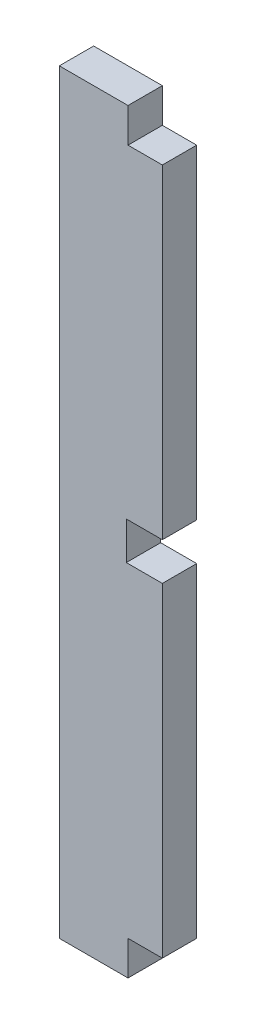
ISO-10303-21;
HEADER;
FILE_DESCRIPTION(('STEP AP214'),'2;1');
FILE_NAME('part.step','',(''),(''),'','','');
FILE_SCHEMA(('AUTOMOTIVE_DESIGN { 1 0 10303 214 1 1 1 1 }'));
ENDSEC;
DATA;
#1=APPLICATION_CONTEXT('core data for automotive mechanical design processes');
#2=APPLICATION_PROTOCOL_DEFINITION('international standard','automotive_design',2000,#1);
#3=PRODUCT_CONTEXT('',#1,'mechanical');
#4=PRODUCT('Part','Part','',(#3));
#5=PRODUCT_RELATED_PRODUCT_CATEGORY('part','',(#4));
#6=PRODUCT_DEFINITION_FORMATION('','',#4);
#7=PRODUCT_DEFINITION_CONTEXT('part definition',#1,'design');
#8=PRODUCT_DEFINITION('design','',#6,#7);
#9=PRODUCT_DEFINITION_SHAPE('','',#8);
#10=(LENGTH_UNIT() NAMED_UNIT(*) SI_UNIT(.MILLI.,.METRE.));
#11=(NAMED_UNIT(*) PLANE_ANGLE_UNIT() SI_UNIT($,.RADIAN.));
#12=(NAMED_UNIT(*) SI_UNIT($,.STERADIAN.) SOLID_ANGLE_UNIT());
#13=UNCERTAINTY_MEASURE_WITH_UNIT(LENGTH_MEASURE(1.E-05),#10,'distance_accuracy_value','');
#14=(GEOMETRIC_REPRESENTATION_CONTEXT(3) GLOBAL_UNCERTAINTY_ASSIGNED_CONTEXT((#13)) GLOBAL_UNIT_ASSIGNED_CONTEXT((#10,
#11,#12)) REPRESENTATION_CONTEXT('',''));
#15=CARTESIAN_POINT('',(0.,0.,0.));
#16=DIRECTION('',(0.,0.,1.));
#17=DIRECTION('',(1.,0.,0.));
#18=AXIS2_PLACEMENT_3D('',#15,#16,#17);
#19=CARTESIAN_POINT('',(-131.454340614119,-208.941167374745,2.5));
#20=DIRECTION('',(-1.,0.,0.));
#21=DIRECTION('',(0.,0.,1.));
#22=AXIS2_PLACEMENT_3D('',#19,#20,#21);
#23=PLANE('',#22);
#24=DIRECTION('',(0.,1.,0.));
#25=VECTOR('',#24,1.);
#26=CARTESIAN_POINT('',(-131.454340614119,-208.941167374745,-2.5));
#27=LINE('',#26,#25);
#28=CARTESIAN_POINT('',(-131.454340614119,-213.941167374745,-2.5));
#29=VERTEX_POINT('',#28);
#30=CARTESIAN_POINT('',(-131.454340614119,-208.941167374745,-2.5));
#31=VERTEX_POINT('',#30);
#32=EDGE_CURVE('E152',#29,#31,#27,.T.);
#33=ORIENTED_EDGE('',*,*,#32,.T.);
#34=DIRECTION('',(0.,0.,-1.));
#35=VECTOR('',#34,1.);
#36=CARTESIAN_POINT('',(-131.454340614119,-208.941167374745,2.5));
#37=LINE('',#36,#35);
#38=CARTESIAN_POINT('',(-131.454340614119,-208.941167374745,2.5));
#39=VERTEX_POINT('',#38);
#40=EDGE_CURVE('E11',#39,#31,#37,.T.);
#41=ORIENTED_EDGE('',*,*,#40,.F.);
#42=DIRECTION('',(0.,1.,0.));
#43=VECTOR('',#42,1.);
#44=CARTESIAN_POINT('',(-131.454340614119,-208.941167374745,2.5));
#45=LINE('',#44,#43);
#46=CARTESIAN_POINT('',(-131.454340614119,-213.941167374745,2.5));
#47=VERTEX_POINT('',#46);
#48=EDGE_CURVE('E174',#47,#39,#45,.T.);
#49=ORIENTED_EDGE('',*,*,#48,.F.);
#50=DIRECTION('',(0.,0.,-1.));
#51=VECTOR('',#50,1.);
#52=CARTESIAN_POINT('',(-131.454340614119,-213.941167374745,2.5));
#53=LINE('',#52,#51);
#54=EDGE_CURVE('E148',#47,#29,#53,.T.);
#55=ORIENTED_EDGE('',*,*,#54,.T.);
#56=EDGE_LOOP('',(#33,#41,#49,#55));
#57=FACE_BOUND('',#56,.T.);
#58=ADVANCED_FACE('F32',(#57),#23,.F.);
#59=CARTESIAN_POINT('',(-126.454340614119,-208.941167374745,2.5));
#60=DIRECTION('',(0.,1.,0.));
#61=DIRECTION('',(0.,0.,1.));
#62=AXIS2_PLACEMENT_3D('',#59,#60,#61);
#63=PLANE('',#62);
#64=DIRECTION('',(1.,0.,0.));
#65=VECTOR('',#64,1.);
#66=CARTESIAN_POINT('',(-126.454340614119,-208.941167374745,-2.5));
#67=LINE('',#66,#65);
#68=CARTESIAN_POINT('',(-126.454340614119,-208.941167374745,-2.5));
#69=VERTEX_POINT('',#68);
#70=EDGE_CURVE('E155',#31,#69,#67,.T.);
#71=ORIENTED_EDGE('',*,*,#70,.T.);
#72=DIRECTION('',(0.,0.,-1.));
#73=VECTOR('',#72,1.);
#74=CARTESIAN_POINT('',(-126.454340614119,-208.941167374745,2.5));
#75=LINE('',#74,#73);
#76=CARTESIAN_POINT('',(-126.454340614119,-208.941167374745,2.5));
#77=VERTEX_POINT('',#76);
#78=EDGE_CURVE('E40',#77,#69,#75,.T.);
#79=ORIENTED_EDGE('',*,*,#78,.F.);
#80=DIRECTION('',(1.,0.,0.));
#81=VECTOR('',#80,1.);
#82=CARTESIAN_POINT('',(-126.454340614119,-208.941167374745,2.5));
#83=LINE('',#82,#81);
#84=EDGE_CURVE('E103',#39,#77,#83,.T.);
#85=ORIENTED_EDGE('',*,*,#84,.F.);
#86=ORIENTED_EDGE('',*,*,#40,.T.);
#87=EDGE_LOOP('',(#71,#79,#85,#86));
#88=FACE_BOUND('',#87,.T.);
#89=ADVANCED_FACE('F252',(#88),#63,.F.);
#90=CARTESIAN_POINT('',(-126.454340614119,-161.691167374746,2.5));
#91=DIRECTION('',(-1.,0.,0.));
#92=DIRECTION('',(0.,0.,1.));
#93=AXIS2_PLACEMENT_3D('',#90,#91,#92);
#94=PLANE('',#93);
#95=DIRECTION('',(0.,1.,0.));
#96=VECTOR('',#95,1.);
#97=CARTESIAN_POINT('',(-126.454340614119,-161.691167374746,-2.5));
#98=LINE('',#97,#96);
#99=CARTESIAN_POINT('',(-126.454340614119,-161.691167374746,-2.5));
#100=VERTEX_POINT('',#99);
#101=EDGE_CURVE('E157',#69,#100,#98,.T.);
#102=ORIENTED_EDGE('',*,*,#101,.T.);
#103=DIRECTION('',(0.,0.,-1.));
#104=VECTOR('',#103,1.);
#105=CARTESIAN_POINT('',(-126.454340614119,-161.691167374746,2.5));
#106=LINE('',#105,#104);
#107=CARTESIAN_POINT('',(-126.454340614119,-161.691167374746,2.5));
#108=VERTEX_POINT('',#107);
#109=EDGE_CURVE('E193',#108,#100,#106,.T.);
#110=ORIENTED_EDGE('',*,*,#109,.F.);
#111=DIRECTION('',(0.,1.,0.));
#112=VECTOR('',#111,1.);
#113=CARTESIAN_POINT('',(-126.454340614119,-161.691167374746,2.5));
#114=LINE('',#113,#112);
#115=EDGE_CURVE('E201',#77,#108,#114,.T.);
#116=ORIENTED_EDGE('',*,*,#115,.F.);
#117=ORIENTED_EDGE('',*,*,#78,.T.);
#118=EDGE_LOOP('',(#102,#110,#116,#117));
#119=FACE_BOUND('',#118,.T.);
#120=ADVANCED_FACE('F199',(#119),#94,.F.);
#121=CARTESIAN_POINT('',(-131.704340614119,-161.691167374746,2.5));
#122=DIRECTION('',(0.,-1.,0.));
#123=DIRECTION('',(0.,0.,-1.));
#124=AXIS2_PLACEMENT_3D('',#121,#122,#123);
#125=PLANE('',#124);
#126=DIRECTION('',(-1.,0.,0.));
#127=VECTOR('',#126,1.);
#128=CARTESIAN_POINT('',(-131.704340614119,-161.691167374746,-2.5));
#129=LINE('',#128,#127);
#130=CARTESIAN_POINT('',(-131.704340614119,-161.691167374746,-2.5));
#131=VERTEX_POINT('',#130);
#132=EDGE_CURVE('E159',#100,#131,#129,.T.);
#133=ORIENTED_EDGE('',*,*,#132,.T.);
#134=DIRECTION('',(0.,0.,-1.));
#135=VECTOR('',#134,1.);
#136=CARTESIAN_POINT('',(-131.704340614119,-161.691167374746,2.5));
#137=LINE('',#136,#135);
#138=CARTESIAN_POINT('',(-131.704340614119,-161.691167374746,2.5));
#139=VERTEX_POINT('',#138);
#140=EDGE_CURVE('E190',#139,#131,#137,.T.);
#141=ORIENTED_EDGE('',*,*,#140,.F.);
#142=DIRECTION('',(-1.,0.,0.));
#143=VECTOR('',#142,1.);
#144=CARTESIAN_POINT('',(-131.704340614119,-161.691167374746,2.5));
#145=LINE('',#144,#143);
#146=EDGE_CURVE('E219',#108,#139,#145,.T.);
#147=ORIENTED_EDGE('',*,*,#146,.F.);
#148=ORIENTED_EDGE('',*,*,#109,.T.);
#149=EDGE_LOOP('',(#133,#141,#147,#148));
#150=FACE_BOUND('',#149,.T.);
#151=ADVANCED_FACE('F210',(#150),#125,.F.);
#152=CARTESIAN_POINT('',(-131.704340614119,-156.191167374746,2.5));
#153=DIRECTION('',(-1.,0.,0.));
#154=DIRECTION('',(0.,0.,1.));
#155=AXIS2_PLACEMENT_3D('',#152,#153,#154);
#156=PLANE('',#155);
#157=DIRECTION('',(0.,1.,0.));
#158=VECTOR('',#157,1.);
#159=CARTESIAN_POINT('',(-131.704340614119,-156.191167374746,-2.5));
#160=LINE('',#159,#158);
#161=CARTESIAN_POINT('',(-131.704340614119,-156.191167374746,-2.5));
#162=VERTEX_POINT('',#161);
#163=EDGE_CURVE('E161',#131,#162,#160,.T.);
#164=ORIENTED_EDGE('',*,*,#163,.T.);
#165=DIRECTION('',(0.,0.,-1.));
#166=VECTOR('',#165,1.);
#167=CARTESIAN_POINT('',(-131.704340614119,-156.191167374746,2.5));
#168=LINE('',#167,#166);
#169=CARTESIAN_POINT('',(-131.704340614119,-156.191167374746,2.5));
#170=VERTEX_POINT('',#169);
#171=EDGE_CURVE('E187',#170,#162,#168,.T.);
#172=ORIENTED_EDGE('',*,*,#171,.F.);
#173=DIRECTION('',(0.,1.,0.));
#174=VECTOR('',#173,1.);
#175=CARTESIAN_POINT('',(-131.704340614119,-156.191167374746,2.5));
#176=LINE('',#175,#174);
#177=EDGE_CURVE('E216',#139,#170,#176,.T.);
#178=ORIENTED_EDGE('',*,*,#177,.F.);
#179=ORIENTED_EDGE('',*,*,#140,.T.);
#180=EDGE_LOOP('',(#164,#172,#178,#179));
#181=FACE_BOUND('',#180,.T.);
#182=ADVANCED_FACE('F214',(#181),#156,.F.);
#183=CARTESIAN_POINT('',(-126.454340614119,-156.191167374746,2.5));
#184=DIRECTION('',(0.,1.,0.));
#185=DIRECTION('',(0.,0.,1.));
#186=AXIS2_PLACEMENT_3D('',#183,#184,#185);
#187=PLANE('',#186);
#188=DIRECTION('',(1.,0.,0.));
#189=VECTOR('',#188,1.);
#190=CARTESIAN_POINT('',(-126.454340614119,-156.191167374746,-2.5));
#191=LINE('',#190,#189);
#192=CARTESIAN_POINT('',(-126.454340614119,-156.191167374746,-2.5));
#193=VERTEX_POINT('',#192);
#194=EDGE_CURVE('E163',#162,#193,#191,.T.);
#195=ORIENTED_EDGE('',*,*,#194,.T.);
#196=DIRECTION('',(0.,0.,-1.));
#197=VECTOR('',#196,1.);
#198=CARTESIAN_POINT('',(-126.454340614119,-156.191167374746,2.5));
#199=LINE('',#198,#197);
#200=CARTESIAN_POINT('',(-126.454340614119,-156.191167374746,2.5));
#201=VERTEX_POINT('',#200);
#202=EDGE_CURVE('E184',#201,#193,#199,.T.);
#203=ORIENTED_EDGE('',*,*,#202,.F.);
#204=DIRECTION('',(1.,0.,0.));
#205=VECTOR('',#204,1.);
#206=CARTESIAN_POINT('',(-126.454340614119,-156.191167374746,2.5));
#207=LINE('',#206,#205);
#208=EDGE_CURVE('E218',#170,#201,#207,.T.);
#209=ORIENTED_EDGE('',*,*,#208,.F.);
#210=ORIENTED_EDGE('',*,*,#171,.T.);
#211=EDGE_LOOP('',(#195,#203,#209,#210));
#212=FACE_BOUND('',#211,.T.);
#213=ADVANCED_FACE('F265',(#212),#187,.F.);
#214=CARTESIAN_POINT('',(-126.454340614119,-108.941167374747,2.5));
#215=DIRECTION('',(-1.,0.,0.));
#216=DIRECTION('',(0.,0.,1.));
#217=AXIS2_PLACEMENT_3D('',#214,#215,#216);
#218=PLANE('',#217);
#219=DIRECTION('',(0.,1.,0.));
#220=VECTOR('',#219,1.);
#221=CARTESIAN_POINT('',(-126.454340614119,-108.941167374747,-2.5));
#222=LINE('',#221,#220);
#223=CARTESIAN_POINT('',(-126.454340614119,-108.941167374747,-2.5));
#224=VERTEX_POINT('',#223);
#225=EDGE_CURVE('E165',#193,#224,#222,.T.);
#226=ORIENTED_EDGE('',*,*,#225,.T.);
#227=DIRECTION('',(0.,0.,-1.));
#228=VECTOR('',#227,1.);
#229=CARTESIAN_POINT('',(-126.454340614119,-108.941167374747,2.5));
#230=LINE('',#229,#228);
#231=CARTESIAN_POINT('',(-126.454340614119,-108.941167374747,2.5));
#232=VERTEX_POINT('',#231);
#233=EDGE_CURVE('E181',#232,#224,#230,.T.);
#234=ORIENTED_EDGE('',*,*,#233,.F.);
#235=DIRECTION('',(0.,1.,0.));
#236=VECTOR('',#235,1.);
#237=CARTESIAN_POINT('',(-126.454340614119,-108.941167374747,2.5));
#238=LINE('',#237,#236);
#239=EDGE_CURVE('E221',#201,#232,#238,.T.);
#240=ORIENTED_EDGE('',*,*,#239,.F.);
#241=ORIENTED_EDGE('',*,*,#202,.T.);
#242=EDGE_LOOP('',(#226,#234,#240,#241));
#243=FACE_BOUND('',#242,.T.);
#244=ADVANCED_FACE('F268',(#243),#218,.F.);
#245=CARTESIAN_POINT('',(-131.454340614119,-108.941167374747,2.5));
#246=DIRECTION('',(0.,-1.,0.));
#247=DIRECTION('',(0.,0.,-1.));
#248=AXIS2_PLACEMENT_3D('',#245,#246,#247);
#249=PLANE('',#248);
#250=DIRECTION('',(-1.,0.,0.));
#251=VECTOR('',#250,1.);
#252=CARTESIAN_POINT('',(-131.454340614119,-108.941167374747,-2.5));
#253=LINE('',#252,#251);
#254=CARTESIAN_POINT('',(-131.454340614119,-108.941167374747,-2.5));
#255=VERTEX_POINT('',#254);
#256=EDGE_CURVE('E167',#224,#255,#253,.T.);
#257=ORIENTED_EDGE('',*,*,#256,.T.);
#258=DIRECTION('',(0.,0.,-1.));
#259=VECTOR('',#258,1.);
#260=CARTESIAN_POINT('',(-131.454340614119,-108.941167374747,2.5));
#261=LINE('',#260,#259);
#262=CARTESIAN_POINT('',(-131.454340614119,-108.941167374747,2.5));
#263=VERTEX_POINT('',#262);
#264=EDGE_CURVE('E178',#263,#255,#261,.T.);
#265=ORIENTED_EDGE('',*,*,#264,.F.);
#266=DIRECTION('',(-1.,0.,0.));
#267=VECTOR('',#266,1.);
#268=CARTESIAN_POINT('',(-131.454340614119,-108.941167374747,2.5));
#269=LINE('',#268,#267);
#270=EDGE_CURVE('E227',#232,#263,#269,.T.);
#271=ORIENTED_EDGE('',*,*,#270,.F.);
#272=ORIENTED_EDGE('',*,*,#233,.T.);
#273=EDGE_LOOP('',(#257,#265,#271,#272));
#274=FACE_BOUND('',#273,.T.);
#275=ADVANCED_FACE('F233',(#274),#249,.F.);
#276=CARTESIAN_POINT('',(-131.454340614117,-103.941167374747,2.5));
#277=DIRECTION('',(-1.,2.88657986402544E-13,0.));
#278=DIRECTION('',(-2.88657986402544E-13,-1.,0.));
#279=AXIS2_PLACEMENT_3D('',#276,#277,#278);
#280=PLANE('',#279);
#281=DIRECTION('',(2.88657986402544E-13,1.,0.));
#282=VECTOR('',#281,1.);
#283=CARTESIAN_POINT('',(-131.454340614117,-103.941167374747,-2.5));
#284=LINE('',#283,#282);
#285=CARTESIAN_POINT('',(-131.454340614117,-103.941167374747,-2.5));
#286=VERTEX_POINT('',#285);
#287=EDGE_CURVE('E169',#255,#286,#284,.T.);
#288=ORIENTED_EDGE('',*,*,#287,.T.);
#289=DIRECTION('',(0.,0.,-1.));
#290=VECTOR('',#289,1.);
#291=CARTESIAN_POINT('',(-131.454340614117,-103.941167374747,2.5));
#292=LINE('',#291,#290);
#293=CARTESIAN_POINT('',(-131.454340614117,-103.941167374747,2.5));
#294=VERTEX_POINT('',#293);
#295=EDGE_CURVE('E143',#294,#286,#292,.T.);
#296=ORIENTED_EDGE('',*,*,#295,.F.);
#297=DIRECTION('',(2.88657986402544E-13,1.,0.));
#298=VECTOR('',#297,1.);
#299=CARTESIAN_POINT('',(-131.454340614117,-103.941167374747,2.5));
#300=LINE('',#299,#298);
#301=EDGE_CURVE('E134',#263,#294,#300,.T.);
#302=ORIENTED_EDGE('',*,*,#301,.F.);
#303=ORIENTED_EDGE('',*,*,#264,.T.);
#304=EDGE_LOOP('',(#288,#296,#302,#303));
#305=FACE_BOUND('',#304,.T.);
#306=ADVANCED_FACE('F237',(#305),#280,.F.);
#307=CARTESIAN_POINT('',(-141.454340614118,-103.941167374747,2.5));
#308=DIRECTION('',(0.,-1.,0.));
#309=DIRECTION('',(0.,0.,-1.));
#310=AXIS2_PLACEMENT_3D('',#307,#308,#309);
#311=PLANE('',#310);
#312=DIRECTION('',(-1.,0.,0.));
#313=VECTOR('',#312,1.);
#314=CARTESIAN_POINT('',(-141.454340614118,-103.941167374747,-2.5));
#315=LINE('',#314,#313);
#316=CARTESIAN_POINT('',(-141.454340614118,-103.941167374747,-2.5));
#317=VERTEX_POINT('',#316);
#318=EDGE_CURVE('E142',#286,#317,#315,.T.);
#319=ORIENTED_EDGE('',*,*,#318,.T.);
#320=DIRECTION('',(0.,0.,-1.));
#321=VECTOR('',#320,1.);
#322=CARTESIAN_POINT('',(-141.454340614118,-103.941167374747,2.5));
#323=LINE('',#322,#321);
#324=CARTESIAN_POINT('',(-141.454340614118,-103.941167374747,2.5));
#325=VERTEX_POINT('',#324);
#326=EDGE_CURVE('E139',#325,#317,#323,.T.);
#327=ORIENTED_EDGE('',*,*,#326,.F.);
#328=DIRECTION('',(-1.,0.,0.));
#329=VECTOR('',#328,1.);
#330=CARTESIAN_POINT('',(-141.454340614118,-103.941167374747,2.5));
#331=LINE('',#330,#329);
#332=EDGE_CURVE('E128',#294,#325,#331,.T.);
#333=ORIENTED_EDGE('',*,*,#332,.F.);
#334=ORIENTED_EDGE('',*,*,#295,.T.);
#335=EDGE_LOOP('',(#319,#327,#333,#334));
#336=FACE_BOUND('',#335,.T.);
#337=ADVANCED_FACE('F140',(#336),#311,.F.);
#338=CARTESIAN_POINT('',(-141.454340614118,-213.941167374745,2.5));
#339=DIRECTION('',(1.,0.,0.));
#340=DIRECTION('',(0.,0.,-1.));
#341=AXIS2_PLACEMENT_3D('',#338,#339,#340);
#342=PLANE('',#341);
#343=DIRECTION('',(0.,-1.,0.));
#344=VECTOR('',#343,1.);
#345=CARTESIAN_POINT('',(-141.454340614118,-213.941167374745,-2.5));
#346=LINE('',#345,#344);
#347=CARTESIAN_POINT('',(-141.454340614118,-213.941167374745,-2.5));
#348=VERTEX_POINT('',#347);
#349=EDGE_CURVE('E89',#317,#348,#346,.T.);
#350=ORIENTED_EDGE('',*,*,#349,.T.);
#351=DIRECTION('',(0.,0.,-1.));
#352=VECTOR('',#351,1.);
#353=CARTESIAN_POINT('',(-141.454340614118,-213.941167374745,2.5));
#354=LINE('',#353,#352);
#355=CARTESIAN_POINT('',(-141.454340614118,-213.941167374745,2.5));
#356=VERTEX_POINT('',#355);
#357=EDGE_CURVE('E144',#356,#348,#354,.T.);
#358=ORIENTED_EDGE('',*,*,#357,.F.);
#359=DIRECTION('',(0.,-1.,0.));
#360=VECTOR('',#359,1.);
#361=CARTESIAN_POINT('',(-141.454340614118,-213.941167374745,2.5));
#362=LINE('',#361,#360);
#363=EDGE_CURVE('E132',#325,#356,#362,.T.);
#364=ORIENTED_EDGE('',*,*,#363,.F.);
#365=ORIENTED_EDGE('',*,*,#326,.T.);
#366=EDGE_LOOP('',(#350,#358,#364,#365));
#367=FACE_BOUND('',#366,.T.);
#368=ADVANCED_FACE('F146',(#367),#342,.F.);
#369=CARTESIAN_POINT('',(-131.454340614119,-213.941167374745,2.5));
#370=DIRECTION('',(0.,1.,0.));
#371=DIRECTION('',(0.,0.,1.));
#372=AXIS2_PLACEMENT_3D('',#369,#370,#371);
#373=PLANE('',#372);
#374=DIRECTION('',(1.,0.,0.));
#375=VECTOR('',#374,1.);
#376=CARTESIAN_POINT('',(-131.454340614119,-213.941167374745,-2.5));
#377=LINE('',#376,#375);
#378=EDGE_CURVE('E95',#348,#29,#377,.T.);
#379=ORIENTED_EDGE('',*,*,#378,.T.);
#380=ORIENTED_EDGE('',*,*,#54,.F.);
#381=DIRECTION('',(1.,0.,0.));
#382=VECTOR('',#381,1.);
#383=CARTESIAN_POINT('',(-131.454340614119,-213.941167374745,2.5));
#384=LINE('',#383,#382);
#385=EDGE_CURVE('E48',#356,#47,#384,.T.);
#386=ORIENTED_EDGE('',*,*,#385,.F.);
#387=ORIENTED_EDGE('',*,*,#357,.T.);
#388=EDGE_LOOP('',(#379,#380,#386,#387));
#389=FACE_BOUND('',#388,.T.);
#390=ADVANCED_FACE('F241',(#389),#373,.F.);
#391=CARTESIAN_POINT('',(0.,0.,2.5));
#392=DIRECTION('',(0.,0.,-1.));
#393=DIRECTION('',(-1.,0.,0.));
#394=AXIS2_PLACEMENT_3D('',#391,#392,#393);
#395=PLANE('',#394);
#396=ORIENTED_EDGE('',*,*,#48,.T.);
#397=ORIENTED_EDGE('',*,*,#84,.T.);
#398=ORIENTED_EDGE('',*,*,#115,.T.);
#399=ORIENTED_EDGE('',*,*,#146,.T.);
#400=ORIENTED_EDGE('',*,*,#177,.T.);
#401=ORIENTED_EDGE('',*,*,#208,.T.);
#402=ORIENTED_EDGE('',*,*,#239,.T.);
#403=ORIENTED_EDGE('',*,*,#270,.T.);
#404=ORIENTED_EDGE('',*,*,#301,.T.);
#405=ORIENTED_EDGE('',*,*,#332,.T.);
#406=ORIENTED_EDGE('',*,*,#363,.T.);
#407=ORIENTED_EDGE('',*,*,#385,.T.);
#408=EDGE_LOOP('',(#396,#397,#398,#399,#400,#401,#402,#403,#404,#405,#406,#407));
#409=FACE_BOUND('',#408,.T.);
#410=ADVANCED_FACE('F130',(#409),#395,.F.);
#411=CARTESIAN_POINT('',(0.,0.,-2.5));
#412=DIRECTION('',(0.,0.,-1.));
#413=DIRECTION('',(-1.,0.,0.));
#414=AXIS2_PLACEMENT_3D('',#411,#412,#413);
#415=PLANE('',#414);
#416=ORIENTED_EDGE('',*,*,#32,.F.);
#417=ORIENTED_EDGE('',*,*,#378,.F.);
#418=ORIENTED_EDGE('',*,*,#349,.F.);
#419=ORIENTED_EDGE('',*,*,#318,.F.);
#420=ORIENTED_EDGE('',*,*,#287,.F.);
#421=ORIENTED_EDGE('',*,*,#256,.F.);
#422=ORIENTED_EDGE('',*,*,#225,.F.);
#423=ORIENTED_EDGE('',*,*,#194,.F.);
#424=ORIENTED_EDGE('',*,*,#163,.F.);
#425=ORIENTED_EDGE('',*,*,#132,.F.);
#426=ORIENTED_EDGE('',*,*,#101,.F.);
#427=ORIENTED_EDGE('',*,*,#70,.F.);
#428=EDGE_LOOP('',(#416,#417,#418,#419,#420,#421,#422,#423,#424,#425,#426,#427));
#429=FACE_BOUND('',#428,.T.);
#430=ADVANCED_FACE('F205',(#429),#415,.T.);
#431=CLOSED_SHELL('',(#58,#89,#120,#151,#182,#213,#244,#275,#306,#337,#368,#390,#410,#430));
#432=MANIFOLD_SOLID_BREP('B2',#431);
#433=ADVANCED_BREP_SHAPE_REPRESENTATION('',(#18,#432),#14);
#434=SHAPE_DEFINITION_REPRESENTATION(#9,#433);
ENDSEC;
END-ISO-10303-21;
